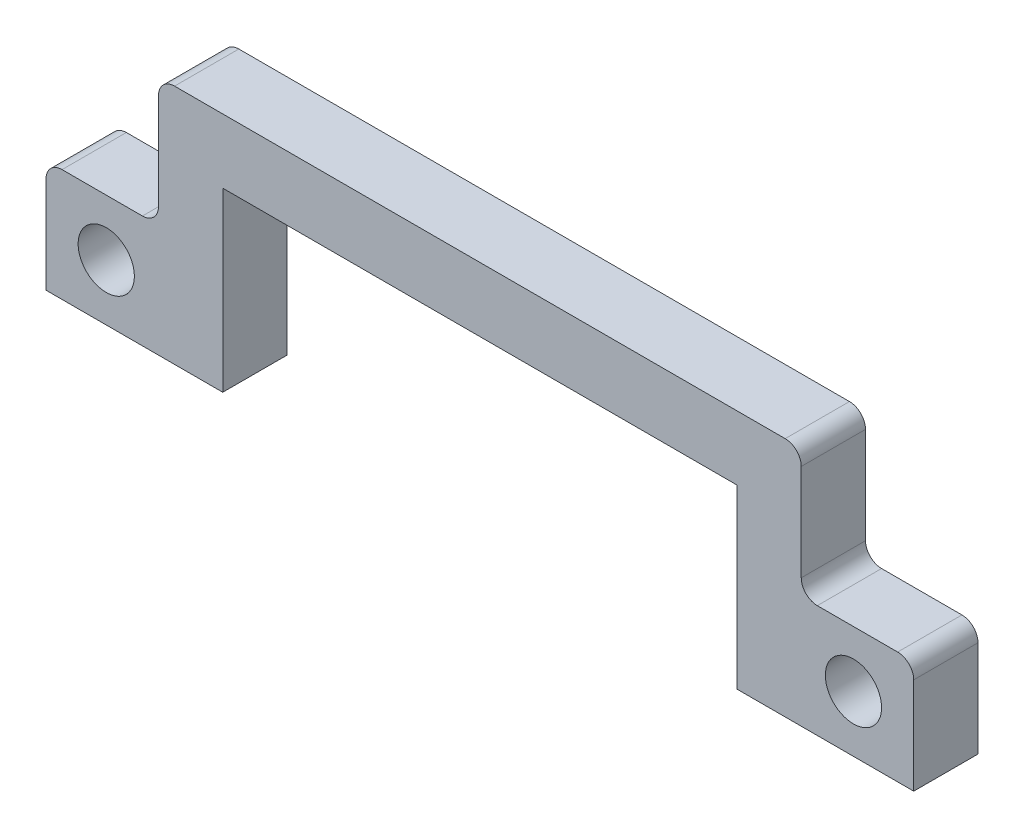
ISO-10303-21;
HEADER;
FILE_DESCRIPTION(('STEP AP214'),'2;1');
FILE_NAME('part.step','',(''),(''),'','','');
FILE_SCHEMA(('AUTOMOTIVE_DESIGN { 1 0 10303 214 1 1 1 1 }'));
ENDSEC;
DATA;
#1=APPLICATION_CONTEXT('core data for automotive mechanical design processes');
#2=APPLICATION_PROTOCOL_DEFINITION('international standard','automotive_design',2000,#1);
#3=PRODUCT_CONTEXT('',#1,'mechanical');
#4=PRODUCT('Part','Part','',(#3));
#5=PRODUCT_RELATED_PRODUCT_CATEGORY('part','',(#4));
#6=PRODUCT_DEFINITION_FORMATION('','',#4);
#7=PRODUCT_DEFINITION_CONTEXT('part definition',#1,'design');
#8=PRODUCT_DEFINITION('design','',#6,#7);
#9=PRODUCT_DEFINITION_SHAPE('','',#8);
#10=(LENGTH_UNIT() NAMED_UNIT(*) SI_UNIT(.MILLI.,.METRE.));
#11=(NAMED_UNIT(*) PLANE_ANGLE_UNIT() SI_UNIT($,.RADIAN.));
#12=(NAMED_UNIT(*) SI_UNIT($,.STERADIAN.) SOLID_ANGLE_UNIT());
#13=UNCERTAINTY_MEASURE_WITH_UNIT(LENGTH_MEASURE(1.E-05),#10,'distance_accuracy_value','');
#14=(GEOMETRIC_REPRESENTATION_CONTEXT(3) GLOBAL_UNCERTAINTY_ASSIGNED_CONTEXT((#13)) GLOBAL_UNIT_ASSIGNED_CONTEXT((#10,
#11,#12)) REPRESENTATION_CONTEXT('',''));
#15=CARTESIAN_POINT('',(0.,0.,0.));
#16=DIRECTION('',(0.,0.,1.));
#17=DIRECTION('',(1.,0.,0.));
#18=AXIS2_PLACEMENT_3D('',#15,#16,#17);
#19=CARTESIAN_POINT('',(-27.,-4.,4.));
#20=DIRECTION('',(1.,0.,0.));
#21=DIRECTION('',(0.,0.,-1.));
#22=AXIS2_PLACEMENT_3D('',#19,#20,#21);
#23=PLANE('',#22);
#24=DIRECTION('',(0.,-1.,0.));
#25=VECTOR('',#24,1.);
#26=CARTESIAN_POINT('',(-27.,-4.,4.));
#27=LINE('',#26,#25);
#28=CARTESIAN_POINT('',(-27.,-5.,4.));
#29=VERTEX_POINT('',#28);
#30=CARTESIAN_POINT('',(-27.,-11.,4.));
#31=VERTEX_POINT('',#30);
#32=EDGE_CURVE('E171',#29,#31,#27,.T.);
#33=ORIENTED_EDGE('',*,*,#32,.F.);
#34=DIRECTION('',(0.,0.,-1.));
#35=VECTOR('',#34,1.);
#36=CARTESIAN_POINT('',(-27.,-5.,4.));
#37=LINE('',#36,#35);
#38=CARTESIAN_POINT('',(-27.,-5.,0.));
#39=VERTEX_POINT('',#38);
#40=EDGE_CURVE('E253',#29,#39,#37,.T.);
#41=ORIENTED_EDGE('',*,*,#40,.T.);
#42=DIRECTION('',(0.,-1.,0.));
#43=VECTOR('',#42,1.);
#44=CARTESIAN_POINT('',(-27.,-4.,0.));
#45=LINE('',#44,#43);
#46=CARTESIAN_POINT('',(-27.,-11.,0.));
#47=VERTEX_POINT('',#46);
#48=EDGE_CURVE('E197',#39,#47,#45,.T.);
#49=ORIENTED_EDGE('',*,*,#48,.T.);
#50=DIRECTION('',(0.,0.,-1.));
#51=VECTOR('',#50,1.);
#52=CARTESIAN_POINT('',(-27.,-11.,4.));
#53=LINE('',#52,#51);
#54=EDGE_CURVE('E189',#31,#47,#53,.T.);
#55=ORIENTED_EDGE('',*,*,#54,.F.);
#56=EDGE_LOOP('',(#33,#41,#49,#55));
#57=FACE_BOUND('',#56,.T.);
#58=ADVANCED_FACE('F47',(#57),#23,.F.);
#59=CARTESIAN_POINT('',(-27.,-11.,4.));
#60=DIRECTION('',(0.,1.,0.));
#61=DIRECTION('',(0.,0.,1.));
#62=AXIS2_PLACEMENT_3D('',#59,#60,#61);
#63=PLANE('',#62);
#64=DIRECTION('',(1.,0.,0.));
#65=VECTOR('',#64,1.);
#66=CARTESIAN_POINT('',(-27.,-11.,0.));
#67=LINE('',#66,#65);
#68=CARTESIAN_POINT('',(-16.,-11.,0.));
#69=VERTEX_POINT('',#68);
#70=EDGE_CURVE('E310',#47,#69,#67,.T.);
#71=ORIENTED_EDGE('',*,*,#70,.T.);
#72=DIRECTION('',(0.,0.,-1.));
#73=VECTOR('',#72,1.);
#74=CARTESIAN_POINT('',(-16.,-11.,4.));
#75=LINE('',#74,#73);
#76=CARTESIAN_POINT('',(-16.,-11.,4.));
#77=VERTEX_POINT('',#76);
#78=EDGE_CURVE('E191',#77,#69,#75,.T.);
#79=ORIENTED_EDGE('',*,*,#78,.F.);
#80=DIRECTION('',(1.,0.,0.));
#81=VECTOR('',#80,1.);
#82=CARTESIAN_POINT('',(-27.,-11.,4.));
#83=LINE('',#82,#81);
#84=EDGE_CURVE('E175',#31,#77,#83,.T.);
#85=ORIENTED_EDGE('',*,*,#84,.F.);
#86=ORIENTED_EDGE('',*,*,#54,.T.);
#87=EDGE_LOOP('',(#71,#79,#85,#86));
#88=FACE_BOUND('',#87,.T.);
#89=ADVANCED_FACE('F188',(#88),#63,.F.);
#90=CARTESIAN_POINT('',(-16.,-11.,4.));
#91=DIRECTION('',(-1.,0.,0.));
#92=DIRECTION('',(0.,0.,1.));
#93=AXIS2_PLACEMENT_3D('',#90,#91,#92);
#94=PLANE('',#93);
#95=DIRECTION('',(0.,1.,0.));
#96=VECTOR('',#95,1.);
#97=CARTESIAN_POINT('',(-16.,-11.,0.));
#98=LINE('',#97,#96);
#99=CARTESIAN_POINT('',(-16.,0.,0.));
#100=VERTEX_POINT('',#99);
#101=EDGE_CURVE('E314',#69,#100,#98,.T.);
#102=ORIENTED_EDGE('',*,*,#101,.T.);
#103=DIRECTION('',(0.,0.,-1.));
#104=VECTOR('',#103,1.);
#105=CARTESIAN_POINT('',(-16.,0.,4.));
#106=LINE('',#105,#104);
#107=CARTESIAN_POINT('',(-16.,0.,4.));
#108=VERTEX_POINT('',#107);
#109=EDGE_CURVE('E206',#108,#100,#106,.T.);
#110=ORIENTED_EDGE('',*,*,#109,.F.);
#111=DIRECTION('',(0.,1.,0.));
#112=VECTOR('',#111,1.);
#113=CARTESIAN_POINT('',(-16.,-11.,4.));
#114=LINE('',#113,#112);
#115=EDGE_CURVE('E194',#77,#108,#114,.T.);
#116=ORIENTED_EDGE('',*,*,#115,.F.);
#117=ORIENTED_EDGE('',*,*,#78,.T.);
#118=EDGE_LOOP('',(#102,#110,#116,#117));
#119=FACE_BOUND('',#118,.T.);
#120=ADVANCED_FACE('F437',(#119),#94,.F.);
#121=CARTESIAN_POINT('',(-16.,0.,4.));
#122=DIRECTION('',(0.,1.,0.));
#123=DIRECTION('',(0.,0.,1.));
#124=AXIS2_PLACEMENT_3D('',#121,#122,#123);
#125=PLANE('',#124);
#126=DIRECTION('',(1.,0.,0.));
#127=VECTOR('',#126,1.);
#128=CARTESIAN_POINT('',(-16.,0.,0.));
#129=LINE('',#128,#127);
#130=CARTESIAN_POINT('',(16.,0.,0.));
#131=VERTEX_POINT('',#130);
#132=EDGE_CURVE('E317',#100,#131,#129,.T.);
#133=ORIENTED_EDGE('',*,*,#132,.T.);
#134=DIRECTION('',(0.,0.,-1.));
#135=VECTOR('',#134,1.);
#136=CARTESIAN_POINT('',(16.,0.,4.));
#137=LINE('',#136,#135);
#138=CARTESIAN_POINT('',(16.,0.,4.));
#139=VERTEX_POINT('',#138);
#140=EDGE_CURVE('E346',#139,#131,#137,.T.);
#141=ORIENTED_EDGE('',*,*,#140,.F.);
#142=DIRECTION('',(1.,0.,0.));
#143=VECTOR('',#142,1.);
#144=CARTESIAN_POINT('',(-16.,0.,4.));
#145=LINE('',#144,#143);
#146=EDGE_CURVE('E357',#108,#139,#145,.T.);
#147=ORIENTED_EDGE('',*,*,#146,.F.);
#148=ORIENTED_EDGE('',*,*,#109,.T.);
#149=EDGE_LOOP('',(#133,#141,#147,#148));
#150=FACE_BOUND('',#149,.T.);
#151=ADVANCED_FACE('F355',(#150),#125,.F.);
#152=CARTESIAN_POINT('',(16.,0.,4.));
#153=DIRECTION('',(1.,0.,0.));
#154=DIRECTION('',(0.,0.,-1.));
#155=AXIS2_PLACEMENT_3D('',#152,#153,#154);
#156=PLANE('',#155);
#157=DIRECTION('',(0.,-1.,0.));
#158=VECTOR('',#157,1.);
#159=CARTESIAN_POINT('',(16.,0.,0.));
#160=LINE('',#159,#158);
#161=CARTESIAN_POINT('',(16.,-11.,0.));
#162=VERTEX_POINT('',#161);
#163=EDGE_CURVE('E320',#131,#162,#160,.T.);
#164=ORIENTED_EDGE('',*,*,#163,.T.);
#165=DIRECTION('',(0.,0.,-1.));
#166=VECTOR('',#165,1.);
#167=CARTESIAN_POINT('',(16.,-11.,4.));
#168=LINE('',#167,#166);
#169=CARTESIAN_POINT('',(16.,-11.,4.));
#170=VERTEX_POINT('',#169);
#171=EDGE_CURVE('E302',#170,#162,#168,.T.);
#172=ORIENTED_EDGE('',*,*,#171,.F.);
#173=DIRECTION('',(0.,-1.,0.));
#174=VECTOR('',#173,1.);
#175=CARTESIAN_POINT('',(16.,0.,4.));
#176=LINE('',#175,#174);
#177=EDGE_CURVE('E375',#139,#170,#176,.T.);
#178=ORIENTED_EDGE('',*,*,#177,.F.);
#179=ORIENTED_EDGE('',*,*,#140,.T.);
#180=EDGE_LOOP('',(#164,#172,#178,#179));
#181=FACE_BOUND('',#180,.T.);
#182=ADVANCED_FACE('F365',(#181),#156,.F.);
#183=CARTESIAN_POINT('',(16.,-11.,4.));
#184=DIRECTION('',(0.,1.,0.));
#185=DIRECTION('',(0.,0.,1.));
#186=AXIS2_PLACEMENT_3D('',#183,#184,#185);
#187=PLANE('',#186);
#188=DIRECTION('',(1.,0.,0.));
#189=VECTOR('',#188,1.);
#190=CARTESIAN_POINT('',(16.,-11.,0.));
#191=LINE('',#190,#189);
#192=CARTESIAN_POINT('',(27.,-11.,0.));
#193=VERTEX_POINT('',#192);
#194=EDGE_CURVE('E323',#162,#193,#191,.T.);
#195=ORIENTED_EDGE('',*,*,#194,.T.);
#196=DIRECTION('',(0.,0.,-1.));
#197=VECTOR('',#196,1.);
#198=CARTESIAN_POINT('',(27.,-11.,4.));
#199=LINE('',#198,#197);
#200=CARTESIAN_POINT('',(27.,-11.,4.));
#201=VERTEX_POINT('',#200);
#202=EDGE_CURVE('E296',#201,#193,#199,.T.);
#203=ORIENTED_EDGE('',*,*,#202,.F.);
#204=DIRECTION('',(1.,0.,0.));
#205=VECTOR('',#204,1.);
#206=CARTESIAN_POINT('',(16.,-11.,4.));
#207=LINE('',#206,#205);
#208=EDGE_CURVE('E371',#170,#201,#207,.T.);
#209=ORIENTED_EDGE('',*,*,#208,.F.);
#210=ORIENTED_EDGE('',*,*,#171,.T.);
#211=EDGE_LOOP('',(#195,#203,#209,#210));
#212=FACE_BOUND('',#211,.T.);
#213=ADVANCED_FACE('F369',(#212),#187,.F.);
#214=CARTESIAN_POINT('',(27.,-11.,4.));
#215=DIRECTION('',(-1.,0.,0.));
#216=DIRECTION('',(0.,0.,1.));
#217=AXIS2_PLACEMENT_3D('',#214,#215,#216);
#218=PLANE('',#217);
#219=DIRECTION('',(0.,1.,0.));
#220=VECTOR('',#219,1.);
#221=CARTESIAN_POINT('',(27.,-11.,0.));
#222=LINE('',#221,#220);
#223=CARTESIAN_POINT('',(27.,-5.,0.));
#224=VERTEX_POINT('',#223);
#225=EDGE_CURVE('E326',#193,#224,#222,.T.);
#226=ORIENTED_EDGE('',*,*,#225,.T.);
#227=DIRECTION('',(0.,0.,-1.));
#228=VECTOR('',#227,1.);
#229=CARTESIAN_POINT('',(27.,-5.,4.));
#230=LINE('',#229,#228);
#231=CARTESIAN_POINT('',(27.,-5.,4.));
#232=VERTEX_POINT('',#231);
#233=EDGE_CURVE('E225',#224,#232,#230,.F.);
#234=ORIENTED_EDGE('',*,*,#233,.T.);
#235=DIRECTION('',(0.,1.,0.));
#236=VECTOR('',#235,1.);
#237=CARTESIAN_POINT('',(27.,-11.,4.));
#238=LINE('',#237,#236);
#239=EDGE_CURVE('E374',#201,#232,#238,.T.);
#240=ORIENTED_EDGE('',*,*,#239,.F.);
#241=ORIENTED_EDGE('',*,*,#202,.T.);
#242=EDGE_LOOP('',(#226,#234,#240,#241));
#243=FACE_BOUND('',#242,.T.);
#244=ADVANCED_FACE('F422',(#243),#218,.F.);
#245=CARTESIAN_POINT('',(27.,-4.,4.));
#246=DIRECTION('',(0.,-1.,0.));
#247=DIRECTION('',(0.,0.,-1.));
#248=AXIS2_PLACEMENT_3D('',#245,#246,#247);
#249=PLANE('',#248);
#250=DIRECTION('',(-1.,0.,0.));
#251=VECTOR('',#250,1.);
#252=CARTESIAN_POINT('',(27.,-4.,4.));
#253=LINE('',#252,#251);
#254=CARTESIAN_POINT('',(26.,-4.,4.));
#255=VERTEX_POINT('',#254);
#256=CARTESIAN_POINT('',(21.,-4.,4.));
#257=VERTEX_POINT('',#256);
#258=EDGE_CURVE('E379',#255,#257,#253,.T.);
#259=ORIENTED_EDGE('',*,*,#258,.F.);
#260=DIRECTION('',(0.,0.,-1.));
#261=VECTOR('',#260,1.);
#262=CARTESIAN_POINT('',(26.,-4.,4.));
#263=LINE('',#262,#261);
#264=CARTESIAN_POINT('',(26.,-4.,0.));
#265=VERTEX_POINT('',#264);
#266=EDGE_CURVE('E204',#255,#265,#263,.T.);
#267=ORIENTED_EDGE('',*,*,#266,.T.);
#268=DIRECTION('',(-1.,0.,0.));
#269=VECTOR('',#268,1.);
#270=CARTESIAN_POINT('',(27.,-4.,0.));
#271=LINE('',#270,#269);
#272=CARTESIAN_POINT('',(21.,-4.,0.));
#273=VERTEX_POINT('',#272);
#274=EDGE_CURVE('E330',#265,#273,#271,.T.);
#275=ORIENTED_EDGE('',*,*,#274,.T.);
#276=DIRECTION('',(0.,0.,-1.));
#277=VECTOR('',#276,1.);
#278=CARTESIAN_POINT('',(21.,-4.,4.));
#279=LINE('',#278,#277);
#280=EDGE_CURVE('E200',#273,#257,#279,.F.);
#281=ORIENTED_EDGE('',*,*,#280,.T.);
#282=EDGE_LOOP('',(#259,#267,#275,#281));
#283=FACE_BOUND('',#282,.T.);
#284=ADVANCED_FACE('F415',(#283),#249,.F.);
#285=CARTESIAN_POINT('',(20.,-4.,4.));
#286=DIRECTION('',(-1.,0.,0.));
#287=DIRECTION('',(0.,0.,1.));
#288=AXIS2_PLACEMENT_3D('',#285,#286,#287);
#289=PLANE('',#288);
#290=DIRECTION('',(0.,1.,0.));
#291=VECTOR('',#290,1.);
#292=CARTESIAN_POINT('',(20.,-4.,4.));
#293=LINE('',#292,#291);
#294=CARTESIAN_POINT('',(20.,-3.,4.));
#295=VERTEX_POINT('',#294);
#296=CARTESIAN_POINT('',(20.,2.99999999999999,4.));
#297=VERTEX_POINT('',#296);
#298=EDGE_CURVE('E387',#295,#297,#293,.T.);
#299=ORIENTED_EDGE('',*,*,#298,.F.);
#300=DIRECTION('',(0.,0.,-1.));
#301=VECTOR('',#300,1.);
#302=CARTESIAN_POINT('',(20.,-3.,0.));
#303=LINE('',#302,#301);
#304=CARTESIAN_POINT('',(20.,-3.,0.));
#305=VERTEX_POINT('',#304);
#306=EDGE_CURVE('E242',#295,#305,#303,.T.);
#307=ORIENTED_EDGE('',*,*,#306,.T.);
#308=DIRECTION('',(0.,1.,0.));
#309=VECTOR('',#308,1.);
#310=CARTESIAN_POINT('',(20.,-4.,0.));
#311=LINE('',#310,#309);
#312=CARTESIAN_POINT('',(20.,2.99999999999999,0.));
#313=VERTEX_POINT('',#312);
#314=EDGE_CURVE('E334',#305,#313,#311,.T.);
#315=ORIENTED_EDGE('',*,*,#314,.T.);
#316=DIRECTION('',(0.,0.,-1.));
#317=VECTOR('',#316,1.);
#318=CARTESIAN_POINT('',(20.,2.99999999999999,4.));
#319=LINE('',#318,#317);
#320=EDGE_CURVE('E239',#313,#297,#319,.F.);
#321=ORIENTED_EDGE('',*,*,#320,.T.);
#322=EDGE_LOOP('',(#299,#307,#315,#321));
#323=FACE_BOUND('',#322,.T.);
#324=ADVANCED_FACE('F407',(#323),#289,.F.);
#325=CARTESIAN_POINT('',(20.,3.99999999999999,4.));
#326=DIRECTION('',(0.,-1.,0.));
#327=DIRECTION('',(0.,0.,-1.));
#328=AXIS2_PLACEMENT_3D('',#325,#326,#327);
#329=PLANE('',#328);
#330=DIRECTION('',(-1.,0.,0.));
#331=VECTOR('',#330,1.);
#332=CARTESIAN_POINT('',(20.,3.99999999999999,4.));
#333=LINE('',#332,#331);
#334=CARTESIAN_POINT('',(19.,3.99999999999999,4.));
#335=VERTEX_POINT('',#334);
#336=CARTESIAN_POINT('',(-19.,3.99999999999999,4.));
#337=VERTEX_POINT('',#336);
#338=EDGE_CURVE('E304',#335,#337,#333,.T.);
#339=ORIENTED_EDGE('',*,*,#338,.F.);
#340=DIRECTION('',(0.,0.,-1.));
#341=VECTOR('',#340,1.);
#342=CARTESIAN_POINT('',(19.,3.99999999999999,4.));
#343=LINE('',#342,#341);
#344=CARTESIAN_POINT('',(19.,3.99999999999999,0.));
#345=VERTEX_POINT('',#344);
#346=EDGE_CURVE('E249',#335,#345,#343,.T.);
#347=ORIENTED_EDGE('',*,*,#346,.T.);
#348=DIRECTION('',(-1.,0.,0.));
#349=VECTOR('',#348,1.);
#350=CARTESIAN_POINT('',(20.,3.99999999999999,0.));
#351=LINE('',#350,#349);
#352=CARTESIAN_POINT('',(-19.,3.99999999999999,0.));
#353=VERTEX_POINT('',#352);
#354=EDGE_CURVE('E290',#345,#353,#351,.T.);
#355=ORIENTED_EDGE('',*,*,#354,.T.);
#356=DIRECTION('',(0.,0.,-1.));
#357=VECTOR('',#356,1.);
#358=CARTESIAN_POINT('',(-19.,3.99999999999999,4.));
#359=LINE('',#358,#357);
#360=EDGE_CURVE('E246',#353,#337,#359,.F.);
#361=ORIENTED_EDGE('',*,*,#360,.T.);
#362=EDGE_LOOP('',(#339,#347,#355,#361));
#363=FACE_BOUND('',#362,.T.);
#364=ADVANCED_FACE('F400',(#363),#329,.F.);
#365=CARTESIAN_POINT('',(-20.,3.99999999999999,4.));
#366=DIRECTION('',(1.,0.,0.));
#367=DIRECTION('',(0.,0.,-1.));
#368=AXIS2_PLACEMENT_3D('',#365,#366,#367);
#369=PLANE('',#368);
#370=DIRECTION('',(0.,-1.,0.));
#371=VECTOR('',#370,1.);
#372=CARTESIAN_POINT('',(-20.,3.99999999999999,0.));
#373=LINE('',#372,#371);
#374=CARTESIAN_POINT('',(-20.,2.99999999999999,0.));
#375=VERTEX_POINT('',#374);
#376=CARTESIAN_POINT('',(-20.,-3.,0.));
#377=VERTEX_POINT('',#376);
#378=EDGE_CURVE('E281',#375,#377,#373,.T.);
#379=ORIENTED_EDGE('',*,*,#378,.T.);
#380=DIRECTION('',(0.,0.,-1.));
#381=VECTOR('',#380,1.);
#382=CARTESIAN_POINT('',(-20.,-3.,4.));
#383=LINE('',#382,#381);
#384=CARTESIAN_POINT('',(-20.,-3.,4.));
#385=VERTEX_POINT('',#384);
#386=EDGE_CURVE('E266',#377,#385,#383,.F.);
#387=ORIENTED_EDGE('',*,*,#386,.T.);
#388=DIRECTION('',(0.,-1.,0.));
#389=VECTOR('',#388,1.);
#390=CARTESIAN_POINT('',(-20.,3.99999999999999,4.));
#391=LINE('',#390,#389);
#392=CARTESIAN_POINT('',(-20.,2.99999999999999,4.));
#393=VERTEX_POINT('',#392);
#394=EDGE_CURVE('E297',#393,#385,#391,.T.);
#395=ORIENTED_EDGE('',*,*,#394,.F.);
#396=DIRECTION('',(0.,0.,-1.));
#397=VECTOR('',#396,1.);
#398=CARTESIAN_POINT('',(-20.,2.99999999999999,4.));
#399=LINE('',#398,#397);
#400=EDGE_CURVE('E262',#393,#375,#399,.T.);
#401=ORIENTED_EDGE('',*,*,#400,.T.);
#402=EDGE_LOOP('',(#379,#387,#395,#401));
#403=FACE_BOUND('',#402,.T.);
#404=ADVANCED_FACE('F286',(#403),#369,.F.);
#405=CARTESIAN_POINT('',(-20.,-4.,4.));
#406=DIRECTION('',(0.,-1.,0.));
#407=DIRECTION('',(0.,0.,-1.));
#408=AXIS2_PLACEMENT_3D('',#405,#406,#407);
#409=PLANE('',#408);
#410=DIRECTION('',(-1.,0.,0.));
#411=VECTOR('',#410,1.);
#412=CARTESIAN_POINT('',(-20.,-4.,0.));
#413=LINE('',#412,#411);
#414=CARTESIAN_POINT('',(-21.,-4.,0.));
#415=VERTEX_POINT('',#414);
#416=CARTESIAN_POINT('',(-26.,-4.,0.));
#417=VERTEX_POINT('',#416);
#418=EDGE_CURVE('E184',#415,#417,#413,.T.);
#419=ORIENTED_EDGE('',*,*,#418,.T.);
#420=DIRECTION('',(0.,0.,-1.));
#421=VECTOR('',#420,1.);
#422=CARTESIAN_POINT('',(-26.,-4.,4.));
#423=LINE('',#422,#421);
#424=CARTESIAN_POINT('',(-26.,-4.,4.));
#425=VERTEX_POINT('',#424);
#426=EDGE_CURVE('E63',#417,#425,#423,.F.);
#427=ORIENTED_EDGE('',*,*,#426,.T.);
#428=DIRECTION('',(-1.,0.,0.));
#429=VECTOR('',#428,1.);
#430=CARTESIAN_POINT('',(-20.,-4.,4.));
#431=LINE('',#430,#429);
#432=CARTESIAN_POINT('',(-21.,-4.,4.));
#433=VERTEX_POINT('',#432);
#434=EDGE_CURVE('E294',#433,#425,#431,.T.);
#435=ORIENTED_EDGE('',*,*,#434,.F.);
#436=DIRECTION('',(0.,0.,-1.));
#437=VECTOR('',#436,1.);
#438=CARTESIAN_POINT('',(-21.,-4.,0.));
#439=LINE('',#438,#437);
#440=EDGE_CURVE('E256',#433,#415,#439,.T.);
#441=ORIENTED_EDGE('',*,*,#440,.T.);
#442=EDGE_LOOP('',(#419,#427,#435,#441));
#443=FACE_BOUND('',#442,.T.);
#444=ADVANCED_FACE('F293',(#443),#409,.F.);
#445=CARTESIAN_POINT('',(0.,0.,4.));
#446=DIRECTION('',(0.,0.,1.));
#447=DIRECTION('',(1.,0.,0.));
#448=AXIS2_PLACEMENT_3D('',#445,#446,#447);
#449=PLANE('',#448);
#450=CARTESIAN_POINT('',(23.25,-7.5,4.));
#451=DIRECTION('',(0.,0.,-1.));
#452=DIRECTION('',(-1.,0.,0.));
#453=AXIS2_PLACEMENT_3D('',#450,#451,#452);
#454=CIRCLE('',#453,1.75);
#455=CARTESIAN_POINT('',(21.5,-7.5,4.));
#456=VERTEX_POINT('',#455);
#457=EDGE_CURVE('E574',#456,#456,#454,.T.);
#458=ORIENTED_EDGE('',*,*,#457,.T.);
#459=EDGE_LOOP('',(#458));
#460=FACE_BOUND('',#459,.T.);
#461=CARTESIAN_POINT('',(-23.25,-7.5,4.));
#462=DIRECTION('',(0.,0.,1.));
#463=DIRECTION('',(1.,0.,0.));
#464=AXIS2_PLACEMENT_3D('',#461,#462,#463);
#465=CIRCLE('',#464,1.75);
#466=CARTESIAN_POINT('',(-21.5,-7.5,4.));
#467=VERTEX_POINT('',#466);
#468=EDGE_CURVE('E566',#467,#467,#465,.T.);
#469=ORIENTED_EDGE('',*,*,#468,.F.);
#470=EDGE_LOOP('',(#469));
#471=FACE_BOUND('',#470,.T.);
#472=ORIENTED_EDGE('',*,*,#239,.T.);
#473=CARTESIAN_POINT('',(26.,-5.,4.));
#474=DIRECTION('',(0.,0.,1.));
#475=DIRECTION('',(1.,0.,0.));
#476=AXIS2_PLACEMENT_3D('',#473,#474,#475);
#477=CIRCLE('',#476,1.);
#478=EDGE_CURVE('E236',#232,#255,#477,.T.);
#479=ORIENTED_EDGE('',*,*,#478,.T.);
#480=ORIENTED_EDGE('',*,*,#258,.T.);
#481=CARTESIAN_POINT('',(21.,-3.,4.));
#482=DIRECTION('',(0.,0.,1.));
#483=DIRECTION('',(1.,0.,0.));
#484=AXIS2_PLACEMENT_3D('',#481,#482,#483);
#485=CIRCLE('',#484,1.);
#486=EDGE_CURVE('E272',#257,#295,#485,.F.);
#487=ORIENTED_EDGE('',*,*,#486,.T.);
#488=ORIENTED_EDGE('',*,*,#298,.T.);
#489=CARTESIAN_POINT('',(19.,2.99999999999999,4.));
#490=DIRECTION('',(0.,0.,1.));
#491=DIRECTION('',(1.,0.,0.));
#492=AXIS2_PLACEMENT_3D('',#489,#490,#491);
#493=CIRCLE('',#492,1.);
#494=EDGE_CURVE('E233',#297,#335,#493,.T.);
#495=ORIENTED_EDGE('',*,*,#494,.T.);
#496=ORIENTED_EDGE('',*,*,#338,.T.);
#497=CARTESIAN_POINT('',(-19.,2.99999999999999,4.));
#498=DIRECTION('',(0.,0.,1.));
#499=DIRECTION('',(1.,0.,0.));
#500=AXIS2_PLACEMENT_3D('',#497,#498,#499);
#501=CIRCLE('',#500,1.);
#502=EDGE_CURVE('E228',#337,#393,#501,.T.);
#503=ORIENTED_EDGE('',*,*,#502,.T.);
#504=ORIENTED_EDGE('',*,*,#394,.T.);
#505=CARTESIAN_POINT('',(-21.,-3.,4.));
#506=DIRECTION('',(0.,0.,1.));
#507=DIRECTION('',(1.,0.,0.));
#508=AXIS2_PLACEMENT_3D('',#505,#506,#507);
#509=CIRCLE('',#508,1.);
#510=EDGE_CURVE('E11',#385,#433,#509,.F.);
#511=ORIENTED_EDGE('',*,*,#510,.T.);
#512=ORIENTED_EDGE('',*,*,#434,.T.);
#513=CARTESIAN_POINT('',(-26.,-5.,4.));
#514=DIRECTION('',(0.,0.,1.));
#515=DIRECTION('',(1.,0.,0.));
#516=AXIS2_PLACEMENT_3D('',#513,#514,#515);
#517=CIRCLE('',#516,1.);
#518=EDGE_CURVE('E178',#425,#29,#517,.T.);
#519=ORIENTED_EDGE('',*,*,#518,.T.);
#520=ORIENTED_EDGE('',*,*,#32,.T.);
#521=ORIENTED_EDGE('',*,*,#84,.T.);
#522=ORIENTED_EDGE('',*,*,#115,.T.);
#523=ORIENTED_EDGE('',*,*,#146,.T.);
#524=ORIENTED_EDGE('',*,*,#177,.T.);
#525=ORIENTED_EDGE('',*,*,#208,.T.);
#526=EDGE_LOOP('',(#472,#479,#480,#487,#488,#495,#496,#503,#504,#511,#512,#519,#520,#521,#522,
#523,#524,#525));
#527=FACE_BOUND('',#526,.T.);
#528=ADVANCED_FACE('F174',(#460,#471,#527),#449,.T.);
#529=CARTESIAN_POINT('',(0.,0.,0.));
#530=DIRECTION('',(0.,0.,1.));
#531=DIRECTION('',(1.,0.,0.));
#532=AXIS2_PLACEMENT_3D('',#529,#530,#531);
#533=PLANE('',#532);
#534=CARTESIAN_POINT('',(23.25,-7.5,0.));
#535=DIRECTION('',(0.,0.,-1.));
#536=DIRECTION('',(-1.,0.,0.));
#537=AXIS2_PLACEMENT_3D('',#534,#535,#536);
#538=CIRCLE('',#537,1.75);
#539=CARTESIAN_POINT('',(21.5,-7.5,0.));
#540=VERTEX_POINT('',#539);
#541=EDGE_CURVE('E570',#540,#540,#538,.T.);
#542=ORIENTED_EDGE('',*,*,#541,.F.);
#543=EDGE_LOOP('',(#542));
#544=FACE_BOUND('',#543,.T.);
#545=CARTESIAN_POINT('',(-23.25,-7.5,0.));
#546=DIRECTION('',(0.,0.,1.));
#547=DIRECTION('',(1.,0.,0.));
#548=AXIS2_PLACEMENT_3D('',#545,#546,#547);
#549=CIRCLE('',#548,1.75);
#550=CARTESIAN_POINT('',(-21.5,-7.5,0.));
#551=VERTEX_POINT('',#550);
#552=EDGE_CURVE('E311',#551,#551,#549,.T.);
#553=ORIENTED_EDGE('',*,*,#552,.T.);
#554=EDGE_LOOP('',(#553));
#555=FACE_BOUND('',#554,.T.);
#556=ORIENTED_EDGE('',*,*,#274,.F.);
#557=CARTESIAN_POINT('',(26.,-5.,0.));
#558=DIRECTION('',(0.,0.,1.));
#559=DIRECTION('',(1.,0.,0.));
#560=AXIS2_PLACEMENT_3D('',#557,#558,#559);
#561=CIRCLE('',#560,1.);
#562=EDGE_CURVE('E222',#265,#224,#561,.F.);
#563=ORIENTED_EDGE('',*,*,#562,.T.);
#564=ORIENTED_EDGE('',*,*,#225,.F.);
#565=ORIENTED_EDGE('',*,*,#194,.F.);
#566=ORIENTED_EDGE('',*,*,#163,.F.);
#567=ORIENTED_EDGE('',*,*,#132,.F.);
#568=ORIENTED_EDGE('',*,*,#101,.F.);
#569=ORIENTED_EDGE('',*,*,#70,.F.);
#570=ORIENTED_EDGE('',*,*,#48,.F.);
#571=CARTESIAN_POINT('',(-26.,-5.,0.));
#572=DIRECTION('',(0.,0.,1.));
#573=DIRECTION('',(1.,0.,0.));
#574=AXIS2_PLACEMENT_3D('',#571,#572,#573);
#575=CIRCLE('',#574,1.);
#576=EDGE_CURVE('E216',#39,#417,#575,.F.);
#577=ORIENTED_EDGE('',*,*,#576,.T.);
#578=ORIENTED_EDGE('',*,*,#418,.F.);
#579=CARTESIAN_POINT('',(-21.,-3.,0.));
#580=DIRECTION('',(0.,0.,1.));
#581=DIRECTION('',(1.,0.,0.));
#582=AXIS2_PLACEMENT_3D('',#579,#580,#581);
#583=CIRCLE('',#582,1.);
#584=EDGE_CURVE('E56',#415,#377,#583,.T.);
#585=ORIENTED_EDGE('',*,*,#584,.T.);
#586=ORIENTED_EDGE('',*,*,#378,.F.);
#587=CARTESIAN_POINT('',(-19.,2.99999999999999,0.));
#588=DIRECTION('',(0.,0.,1.));
#589=DIRECTION('',(1.,0.,0.));
#590=AXIS2_PLACEMENT_3D('',#587,#588,#589);
#591=CIRCLE('',#590,1.);
#592=EDGE_CURVE('E213',#375,#353,#591,.F.);
#593=ORIENTED_EDGE('',*,*,#592,.T.);
#594=ORIENTED_EDGE('',*,*,#354,.F.);
#595=CARTESIAN_POINT('',(19.,2.99999999999999,0.));
#596=DIRECTION('',(0.,0.,1.));
#597=DIRECTION('',(1.,0.,0.));
#598=AXIS2_PLACEMENT_3D('',#595,#596,#597);
#599=CIRCLE('',#598,1.);
#600=EDGE_CURVE('E219',#345,#313,#599,.F.);
#601=ORIENTED_EDGE('',*,*,#600,.T.);
#602=ORIENTED_EDGE('',*,*,#314,.F.);
#603=CARTESIAN_POINT('',(21.,-3.,0.));
#604=DIRECTION('',(0.,0.,1.));
#605=DIRECTION('',(1.,0.,0.));
#606=AXIS2_PLACEMENT_3D('',#603,#604,#605);
#607=CIRCLE('',#606,1.);
#608=EDGE_CURVE('E269',#305,#273,#607,.T.);
#609=ORIENTED_EDGE('',*,*,#608,.T.);
#610=EDGE_LOOP('',(#556,#563,#564,#565,#566,#567,#568,#569,#570,#577,#578,#585,#586,#593,#594,
#601,#602,#609));
#611=FACE_BOUND('',#610,.T.);
#612=ADVANCED_FACE('F280',(#544,#555,#611),#533,.F.);
#613=CARTESIAN_POINT('',(-23.25,-7.5,0.));
#614=DIRECTION('',(0.,0.,1.));
#615=DIRECTION('',(1.,0.,0.));
#616=AXIS2_PLACEMENT_3D('',#613,#614,#615);
#617=CYLINDRICAL_SURFACE('',#616,1.75);
#618=ORIENTED_EDGE('',*,*,#552,.F.);
#619=EDGE_LOOP('',(#618));
#620=FACE_BOUND('',#619,.T.);
#621=ORIENTED_EDGE('',*,*,#468,.T.);
#622=EDGE_LOOP('',(#621));
#623=FACE_BOUND('',#622,.T.);
#624=ADVANCED_FACE('F482',(#620,#623),#617,.F.);
#625=CARTESIAN_POINT('',(23.25,-7.5,0.));
#626=DIRECTION('',(0.,0.,1.));
#627=DIRECTION('',(1.,0.,0.));
#628=AXIS2_PLACEMENT_3D('',#625,#626,#627);
#629=CYLINDRICAL_SURFACE('',#628,1.75);
#630=ORIENTED_EDGE('',*,*,#541,.T.);
#631=EDGE_LOOP('',(#630));
#632=FACE_BOUND('',#631,.T.);
#633=ORIENTED_EDGE('',*,*,#457,.F.);
#634=EDGE_LOOP('',(#633));
#635=FACE_BOUND('',#634,.T.);
#636=ADVANCED_FACE('F443',(#632,#635),#629,.F.);
#637=CARTESIAN_POINT('',(26.,-5.,4.));
#638=DIRECTION('',(0.,0.,-1.));
#639=DIRECTION('',(-1.,0.,0.));
#640=AXIS2_PLACEMENT_3D('',#637,#638,#639);
#641=CYLINDRICAL_SURFACE('',#640,1.);
#642=ORIENTED_EDGE('',*,*,#478,.F.);
#643=ORIENTED_EDGE('',*,*,#233,.F.);
#644=ORIENTED_EDGE('',*,*,#562,.F.);
#645=ORIENTED_EDGE('',*,*,#266,.F.);
#646=EDGE_LOOP('',(#642,#643,#644,#645));
#647=FACE_BOUND('',#646,.T.);
#648=ADVANCED_FACE('F419',(#647),#641,.T.);
#649=CARTESIAN_POINT('',(21.,-3.,4.));
#650=DIRECTION('',(0.,0.,1.));
#651=DIRECTION('',(1.,0.,0.));
#652=AXIS2_PLACEMENT_3D('',#649,#650,#651);
#653=CYLINDRICAL_SURFACE('',#652,1.);
#654=ORIENTED_EDGE('',*,*,#486,.F.);
#655=ORIENTED_EDGE('',*,*,#280,.F.);
#656=ORIENTED_EDGE('',*,*,#608,.F.);
#657=ORIENTED_EDGE('',*,*,#306,.F.);
#658=EDGE_LOOP('',(#654,#655,#656,#657));
#659=FACE_BOUND('',#658,.T.);
#660=ADVANCED_FACE('F411',(#659),#653,.F.);
#661=CARTESIAN_POINT('',(19.,2.99999999999999,4.));
#662=DIRECTION('',(0.,0.,-1.));
#663=DIRECTION('',(-1.,0.,0.));
#664=AXIS2_PLACEMENT_3D('',#661,#662,#663);
#665=CYLINDRICAL_SURFACE('',#664,1.);
#666=ORIENTED_EDGE('',*,*,#494,.F.);
#667=ORIENTED_EDGE('',*,*,#320,.F.);
#668=ORIENTED_EDGE('',*,*,#600,.F.);
#669=ORIENTED_EDGE('',*,*,#346,.F.);
#670=EDGE_LOOP('',(#666,#667,#668,#669));
#671=FACE_BOUND('',#670,.T.);
#672=ADVANCED_FACE('F402',(#671),#665,.T.);
#673=CARTESIAN_POINT('',(-26.,-5.,4.));
#674=DIRECTION('',(0.,0.,-1.));
#675=DIRECTION('',(-1.,0.,0.));
#676=AXIS2_PLACEMENT_3D('',#673,#674,#675);
#677=CYLINDRICAL_SURFACE('',#676,1.);
#678=ORIENTED_EDGE('',*,*,#518,.F.);
#679=ORIENTED_EDGE('',*,*,#426,.F.);
#680=ORIENTED_EDGE('',*,*,#576,.F.);
#681=ORIENTED_EDGE('',*,*,#40,.F.);
#682=EDGE_LOOP('',(#678,#679,#680,#681));
#683=FACE_BOUND('',#682,.T.);
#684=ADVANCED_FACE('F448',(#683),#677,.T.);
#685=CARTESIAN_POINT('',(-21.,-3.,4.));
#686=DIRECTION('',(0.,0.,1.));
#687=DIRECTION('',(1.,0.,0.));
#688=AXIS2_PLACEMENT_3D('',#685,#686,#687);
#689=CYLINDRICAL_SURFACE('',#688,1.);
#690=ORIENTED_EDGE('',*,*,#510,.F.);
#691=ORIENTED_EDGE('',*,*,#386,.F.);
#692=ORIENTED_EDGE('',*,*,#584,.F.);
#693=ORIENTED_EDGE('',*,*,#440,.F.);
#694=EDGE_LOOP('',(#690,#691,#692,#693));
#695=FACE_BOUND('',#694,.T.);
#696=ADVANCED_FACE('F292',(#695),#689,.F.);
#697=CARTESIAN_POINT('',(-19.,2.99999999999999,4.));
#698=DIRECTION('',(0.,0.,-1.));
#699=DIRECTION('',(-1.,0.,0.));
#700=AXIS2_PLACEMENT_3D('',#697,#698,#699);
#701=CYLINDRICAL_SURFACE('',#700,1.);
#702=ORIENTED_EDGE('',*,*,#502,.F.);
#703=ORIENTED_EDGE('',*,*,#360,.F.);
#704=ORIENTED_EDGE('',*,*,#592,.F.);
#705=ORIENTED_EDGE('',*,*,#400,.F.);
#706=EDGE_LOOP('',(#702,#703,#704,#705));
#707=FACE_BOUND('',#706,.T.);
#708=ADVANCED_FACE('F49',(#707),#701,.T.);
#709=CLOSED_SHELL('',(#58,#89,#120,#151,#182,#213,#244,#284,#324,#364,#404,#444,#528,#612,#624,
#636,#648,#660,#672,#684,#696,#708));
#710=MANIFOLD_SOLID_BREP('B2',#709);
#711=ADVANCED_BREP_SHAPE_REPRESENTATION('',(#18,#710),#14);
#712=SHAPE_DEFINITION_REPRESENTATION(#9,#711);
ENDSEC;
END-ISO-10303-21;
